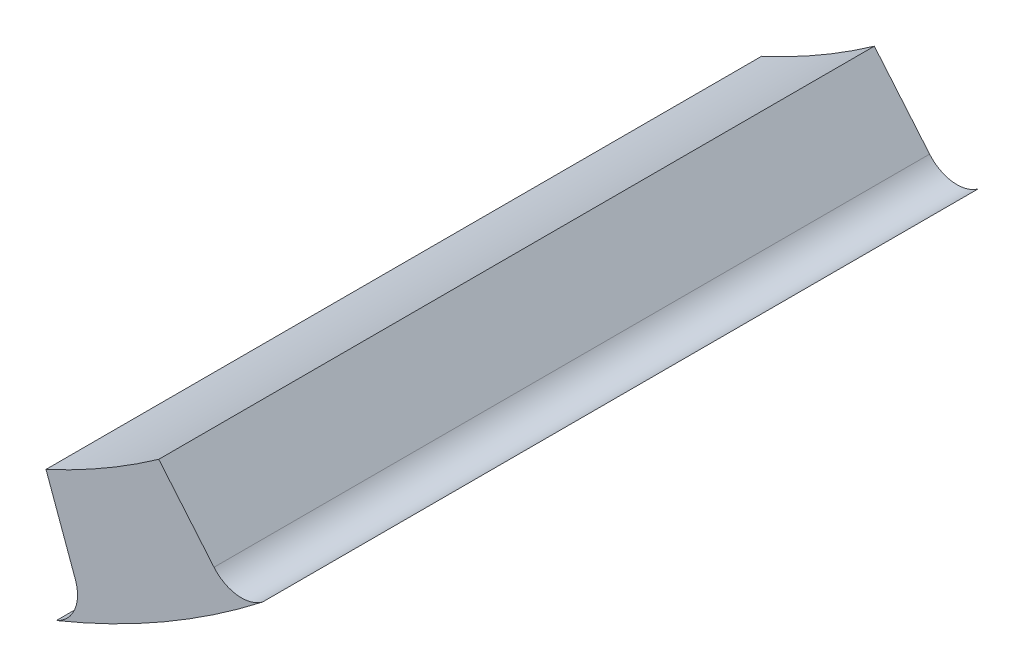
ISO-10303-21;
HEADER;
FILE_DESCRIPTION(('STEP AP214'),'2;1');
FILE_NAME('part.step','',(''),(''),'','','');
FILE_SCHEMA(('AUTOMOTIVE_DESIGN { 1 0 10303 214 1 1 1 1 }'));
ENDSEC;
DATA;
#1=APPLICATION_CONTEXT('core data for automotive mechanical design processes');
#2=APPLICATION_PROTOCOL_DEFINITION('international standard','automotive_design',2000,#1);
#3=PRODUCT_CONTEXT('',#1,'mechanical');
#4=PRODUCT('Part','Part','',(#3));
#5=PRODUCT_RELATED_PRODUCT_CATEGORY('part','',(#4));
#6=PRODUCT_DEFINITION_FORMATION('','',#4);
#7=PRODUCT_DEFINITION_CONTEXT('part definition',#1,'design');
#8=PRODUCT_DEFINITION('design','',#6,#7);
#9=PRODUCT_DEFINITION_SHAPE('','',#8);
#10=(LENGTH_UNIT() NAMED_UNIT(*) SI_UNIT(.MILLI.,.METRE.));
#11=(NAMED_UNIT(*) PLANE_ANGLE_UNIT() SI_UNIT($,.RADIAN.));
#12=(NAMED_UNIT(*) SI_UNIT($,.STERADIAN.) SOLID_ANGLE_UNIT());
#13=UNCERTAINTY_MEASURE_WITH_UNIT(LENGTH_MEASURE(1.E-05),#10,'distance_accuracy_value','');
#14=(GEOMETRIC_REPRESENTATION_CONTEXT(3) GLOBAL_UNCERTAINTY_ASSIGNED_CONTEXT((#13)) GLOBAL_UNIT_ASSIGNED_CONTEXT((#10,
#11,#12)) REPRESENTATION_CONTEXT('',''));
#15=CARTESIAN_POINT('',(0.,0.,0.));
#16=DIRECTION('',(0.,0.,1.));
#17=DIRECTION('',(1.,0.,0.));
#18=AXIS2_PLACEMENT_3D('',#15,#16,#17);
#19=CARTESIAN_POINT('',(-1.39654990263592,2.41889538667069,-84.1911184748173));
#20=DIRECTION('',(0.,0.,1.));
#21=DIRECTION('',(1.,0.,0.));
#22=AXIS2_PLACEMENT_3D('',#19,#20,#21);
#23=CYLINDRICAL_SURFACE('',#22,72.7930955608477);
#24=CARTESIAN_POINT('',(-1.39654990263592,2.41889538667069,-60.));
#25=DIRECTION('',(0.,0.,-1.));
#26=DIRECTION('',(0.,1.,0.));
#27=AXIS2_PLACEMENT_3D('',#24,#25,#26);
#28=CIRCLE('',#27,72.7930955608477);
#29=CARTESIAN_POINT('',(43.2946104365402,-55.040089540569,-60.));
#30=VERTEX_POINT('',#29);
#31=CARTESIAN_POINT('',(26.0188105504321,-65.0142772552795,-60.));
#32=VERTEX_POINT('',#31);
#33=EDGE_CURVE('E111',#30,#32,#28,.T.);
#34=ORIENTED_EDGE('',*,*,#33,.F.);
#35=DIRECTION('',(0.,0.,1.));
#36=VECTOR('',#35,1.);
#37=CARTESIAN_POINT('',(43.2946104365402,-55.040089540569,-84.1911184748173));
#38=LINE('',#37,#36);
#39=CARTESIAN_POINT('',(43.2946104365402,-55.040089540569,0.));
#40=VERTEX_POINT('',#39);
#41=EDGE_CURVE('E39',#30,#40,#38,.T.);
#42=ORIENTED_EDGE('',*,*,#41,.T.);
#43=CARTESIAN_POINT('',(-1.39654990263592,2.41889538667069,0.));
#44=DIRECTION('',(0.,0.,1.));
#45=DIRECTION('',(1.,0.,0.));
#46=AXIS2_PLACEMENT_3D('',#43,#44,#45);
#47=CIRCLE('',#46,72.7930955608477);
#48=CARTESIAN_POINT('',(26.0188105504321,-65.0142772552795,0.));
#49=VERTEX_POINT('',#48);
#50=EDGE_CURVE('E120',#40,#49,#47,.F.);
#51=ORIENTED_EDGE('',*,*,#50,.T.);
#52=DIRECTION('',(0.,0.,1.));
#53=VECTOR('',#52,1.);
#54=CARTESIAN_POINT('',(26.0188105504321,-65.0142772552795,-84.1911184748173));
#55=LINE('',#54,#53);
#56=EDGE_CURVE('E129',#32,#49,#55,.T.);
#57=ORIENTED_EDGE('',*,*,#56,.F.);
#58=EDGE_LOOP('',(#34,#42,#51,#57));
#59=FACE_BOUND('',#58,.T.);
#60=ADVANCED_FACE('F35',(#59),#23,.T.);
#61=CARTESIAN_POINT('',(24.7947348443913,-62.2753653060047,-84.1911184748173));
#62=DIRECTION('',(0.,0.,1.));
#63=DIRECTION('',(1.,0.,0.));
#64=AXIS2_PLACEMENT_3D('',#61,#62,#63);
#65=CYLINDRICAL_SURFACE('',#64,3.);
#66=CARTESIAN_POINT('',(24.7947348443913,-62.2753653060047,-60.));
#67=DIRECTION('',(0.,0.,-1.));
#68=DIRECTION('',(0.,1.,0.));
#69=AXIS2_PLACEMENT_3D('',#66,#67,#68);
#70=CIRCLE('',#69,3.);
#71=CARTESIAN_POINT('',(27.613812706749,-61.2493048760277,-60.));
#72=VERTEX_POINT('',#71);
#73=EDGE_CURVE('E44',#32,#72,#70,.F.);
#74=ORIENTED_EDGE('',*,*,#73,.F.);
#75=ORIENTED_EDGE('',*,*,#56,.T.);
#76=CARTESIAN_POINT('',(24.7947348443913,-62.2753653060047,0.));
#77=DIRECTION('',(0.,0.,1.));
#78=DIRECTION('',(1.,0.,0.));
#79=AXIS2_PLACEMENT_3D('',#76,#77,#78);
#80=CIRCLE('',#79,3.);
#81=CARTESIAN_POINT('',(27.613812706749,-61.2493048760277,0.));
#82=VERTEX_POINT('',#81);
#83=EDGE_CURVE('E126',#49,#82,#80,.T.);
#84=ORIENTED_EDGE('',*,*,#83,.T.);
#85=DIRECTION('',(0.,0.,1.));
#86=VECTOR('',#85,1.);
#87=CARTESIAN_POINT('',(27.613812706749,-61.2493048760277,-84.1911184748173));
#88=LINE('',#87,#86);
#89=EDGE_CURVE('E125',#72,#82,#88,.T.);
#90=ORIENTED_EDGE('',*,*,#89,.F.);
#91=EDGE_LOOP('',(#74,#75,#84,#90));
#92=FACE_BOUND('',#91,.T.);
#93=ADVANCED_FACE('F138',(#92),#65,.F.);
#94=CARTESIAN_POINT('',(4.69846310392954,1.71010071662831,-84.1911184748173));
#95=DIRECTION('',(-0.93969262078591,-0.342020143325663,0.));
#96=DIRECTION('',(0.342020143325663,-0.93969262078591,0.));
#97=AXIS2_PLACEMENT_3D('',#94,#95,#96);
#98=PLANE('',#97);
#99=DIRECTION('',(0.,0.,1.));
#100=VECTOR('',#99,1.);
#101=CARTESIAN_POINT('',(25.1482933703355,-54.4753461720028,-84.1911184748173));
#102=LINE('',#101,#100);
#103=CARTESIAN_POINT('',(25.1482933703355,-54.4753461720028,-60.));
#104=VERTEX_POINT('',#103);
#105=CARTESIAN_POINT('',(25.1482933703355,-54.4753461720028,0.));
#106=VERTEX_POINT('',#105);
#107=EDGE_CURVE('E94',#104,#106,#102,.T.);
#108=ORIENTED_EDGE('',*,*,#107,.F.);
#109=DIRECTION('',(0.342020143325663,-0.93969262078591,0.));
#110=VECTOR('',#109,1.);
#111=CARTESIAN_POINT('',(4.69846310392954,1.71010071662831,-60.));
#112=LINE('',#111,#110);
#113=EDGE_CURVE('E123',#104,#72,#112,.T.);
#114=ORIENTED_EDGE('',*,*,#113,.T.);
#115=ORIENTED_EDGE('',*,*,#89,.T.);
#116=DIRECTION('',(0.342020143325663,-0.939692620785911,0.));
#117=VECTOR('',#116,1.);
#118=CARTESIAN_POINT('',(4.69846310392954,1.71010071662831,0.));
#119=LINE('',#118,#117);
#120=EDGE_CURVE('E112',#106,#82,#119,.T.);
#121=ORIENTED_EDGE('',*,*,#120,.F.);
#122=EDGE_LOOP('',(#108,#114,#115,#121));
#123=FACE_BOUND('',#122,.T.);
#124=ADVANCED_FACE('F135',(#123),#98,.T.);
#125=CARTESIAN_POINT('',(0.,0.,-84.1911184748173));
#126=DIRECTION('',(0.,0.,1.));
#127=DIRECTION('',(1.,0.,0.));
#128=AXIS2_PLACEMENT_3D('',#125,#126,#127);
#129=CYLINDRICAL_SURFACE('',#128,60.);
#130=CARTESIAN_POINT('',(0.,0.,-60.));
#131=DIRECTION('',(0.,0.,-1.));
#132=DIRECTION('',(0.,1.,0.));
#133=AXIS2_PLACEMENT_3D('',#130,#131,#132);
#134=CIRCLE('',#133,60.);
#135=CARTESIAN_POINT('',(34.6028869797375,-49.0167340065361,-60.));
#136=VERTEX_POINT('',#135);
#137=EDGE_CURVE('E11',#104,#136,#134,.F.);
#138=ORIENTED_EDGE('',*,*,#137,.F.);
#139=ORIENTED_EDGE('',*,*,#107,.T.);
#140=CARTESIAN_POINT('',(0.,0.,0.));
#141=DIRECTION('',(0.,0.,1.));
#142=DIRECTION('',(1.,0.,0.));
#143=AXIS2_PLACEMENT_3D('',#140,#141,#142);
#144=CIRCLE('',#143,60.);
#145=CARTESIAN_POINT('',(34.6028869797375,-49.0167340065361,0.));
#146=VERTEX_POINT('',#145);
#147=EDGE_CURVE('E115',#106,#146,#144,.T.);
#148=ORIENTED_EDGE('',*,*,#147,.T.);
#149=DIRECTION('',(0.,0.,1.));
#150=VECTOR('',#149,1.);
#151=CARTESIAN_POINT('',(34.6028869797375,-49.0167340065361,-84.1911184748173));
#152=LINE('',#151,#150);
#153=EDGE_CURVE('E105',#136,#146,#152,.T.);
#154=ORIENTED_EDGE('',*,*,#153,.F.);
#155=EDGE_LOOP('',(#138,#139,#148,#154));
#156=FACE_BOUND('',#155,.T.);
#157=ADVANCED_FACE('F153',(#156),#129,.F.);
#158=CARTESIAN_POINT('',(-3.83022221559491,-3.21393804843268,-84.1911184748173));
#159=DIRECTION('',(0.766044443118981,0.642787609686535,0.));
#160=DIRECTION('',(-0.642787609686535,0.766044443118981,0.));
#161=AXIS2_PLACEMENT_3D('',#158,#159,#160);
#162=PLANE('',#161);
#163=DIRECTION('',(0.,0.,1.));
#164=VECTOR('',#163,1.);
#165=CARTESIAN_POINT('',(39.236547633403,-54.5389157374044,-84.1911184748173));
#166=LINE('',#165,#164);
#167=CARTESIAN_POINT('',(39.236547633403,-54.5389157374044,-60.));
#168=VERTEX_POINT('',#167);
#169=CARTESIAN_POINT('',(39.236547633403,-54.5389157374044,0.));
#170=VERTEX_POINT('',#169);
#171=EDGE_CURVE('E57',#168,#170,#166,.T.);
#172=ORIENTED_EDGE('',*,*,#171,.F.);
#173=DIRECTION('',(-0.642787609686535,0.766044443118981,0.));
#174=VECTOR('',#173,1.);
#175=CARTESIAN_POINT('',(-3.83022221559491,-3.21393804843268,-60.));
#176=LINE('',#175,#174);
#177=EDGE_CURVE('E100',#168,#136,#176,.T.);
#178=ORIENTED_EDGE('',*,*,#177,.T.);
#179=ORIENTED_EDGE('',*,*,#153,.T.);
#180=DIRECTION('',(-0.642787609686535,0.766044443118981,0.));
#181=VECTOR('',#180,1.);
#182=CARTESIAN_POINT('',(-3.83022221559491,-3.21393804843268,0.));
#183=LINE('',#182,#181);
#184=EDGE_CURVE('E103',#170,#146,#183,.T.);
#185=ORIENTED_EDGE('',*,*,#184,.F.);
#186=EDGE_LOOP('',(#172,#178,#179,#185));
#187=FACE_BOUND('',#186,.T.);
#188=ADVANCED_FACE('F98',(#187),#162,.T.);
#189=CARTESIAN_POINT('',(41.5346809627599,-52.6105529083448,-84.1911184748173));
#190=DIRECTION('',(0.,0.,1.));
#191=DIRECTION('',(1.,0.,0.));
#192=AXIS2_PLACEMENT_3D('',#189,#190,#191);
#193=CYLINDRICAL_SURFACE('',#192,3.);
#194=CARTESIAN_POINT('',(41.5346809627599,-52.6105529083448,-60.));
#195=DIRECTION('',(0.,0.,-1.));
#196=DIRECTION('',(0.,1.,0.));
#197=AXIS2_PLACEMENT_3D('',#194,#195,#196);
#198=CIRCLE('',#197,3.);
#199=EDGE_CURVE('E107',#168,#30,#198,.F.);
#200=ORIENTED_EDGE('',*,*,#199,.F.);
#201=ORIENTED_EDGE('',*,*,#171,.T.);
#202=CARTESIAN_POINT('',(41.5346809627599,-52.6105529083448,0.));
#203=DIRECTION('',(0.,0.,1.));
#204=DIRECTION('',(1.,0.,0.));
#205=AXIS2_PLACEMENT_3D('',#202,#203,#204);
#206=CIRCLE('',#205,3.);
#207=EDGE_CURVE('E104',#170,#40,#206,.T.);
#208=ORIENTED_EDGE('',*,*,#207,.T.);
#209=ORIENTED_EDGE('',*,*,#41,.F.);
#210=EDGE_LOOP('',(#200,#201,#208,#209));
#211=FACE_BOUND('',#210,.T.);
#212=ADVANCED_FACE('F108',(#211),#193,.F.);
#213=CARTESIAN_POINT('',(0.,0.,0.));
#214=DIRECTION('',(0.,0.,1.));
#215=DIRECTION('',(1.,0.,0.));
#216=AXIS2_PLACEMENT_3D('',#213,#214,#215);
#217=PLANE('',#216);
#218=ORIENTED_EDGE('',*,*,#50,.F.);
#219=ORIENTED_EDGE('',*,*,#207,.F.);
#220=ORIENTED_EDGE('',*,*,#184,.T.);
#221=ORIENTED_EDGE('',*,*,#147,.F.);
#222=ORIENTED_EDGE('',*,*,#120,.T.);
#223=ORIENTED_EDGE('',*,*,#83,.F.);
#224=EDGE_LOOP('',(#218,#219,#220,#221,#222,#223));
#225=FACE_BOUND('',#224,.T.);
#226=ADVANCED_FACE('F142',(#225),#217,.T.);
#227=CARTESIAN_POINT('',(0.,0.,-60.));
#228=DIRECTION('',(0.,0.,-1.));
#229=DIRECTION('',(-1.,0.,0.));
#230=AXIS2_PLACEMENT_3D('',#227,#228,#229);
#231=PLANE('',#230);
#232=ORIENTED_EDGE('',*,*,#199,.T.);
#233=ORIENTED_EDGE('',*,*,#33,.T.);
#234=ORIENTED_EDGE('',*,*,#73,.T.);
#235=ORIENTED_EDGE('',*,*,#113,.F.);
#236=ORIENTED_EDGE('',*,*,#137,.T.);
#237=ORIENTED_EDGE('',*,*,#177,.F.);
#238=EDGE_LOOP('',(#232,#233,#234,#235,#236,#237));
#239=FACE_BOUND('',#238,.T.);
#240=ADVANCED_FACE('F37',(#239),#231,.T.);
#241=CLOSED_SHELL('',(#60,#93,#124,#157,#188,#212,#226,#240));
#242=MANIFOLD_SOLID_BREP('B2',#241);
#243=ADVANCED_BREP_SHAPE_REPRESENTATION('',(#18,#242),#14);
#244=SHAPE_DEFINITION_REPRESENTATION(#9,#243);
ENDSEC;
END-ISO-10303-21;
